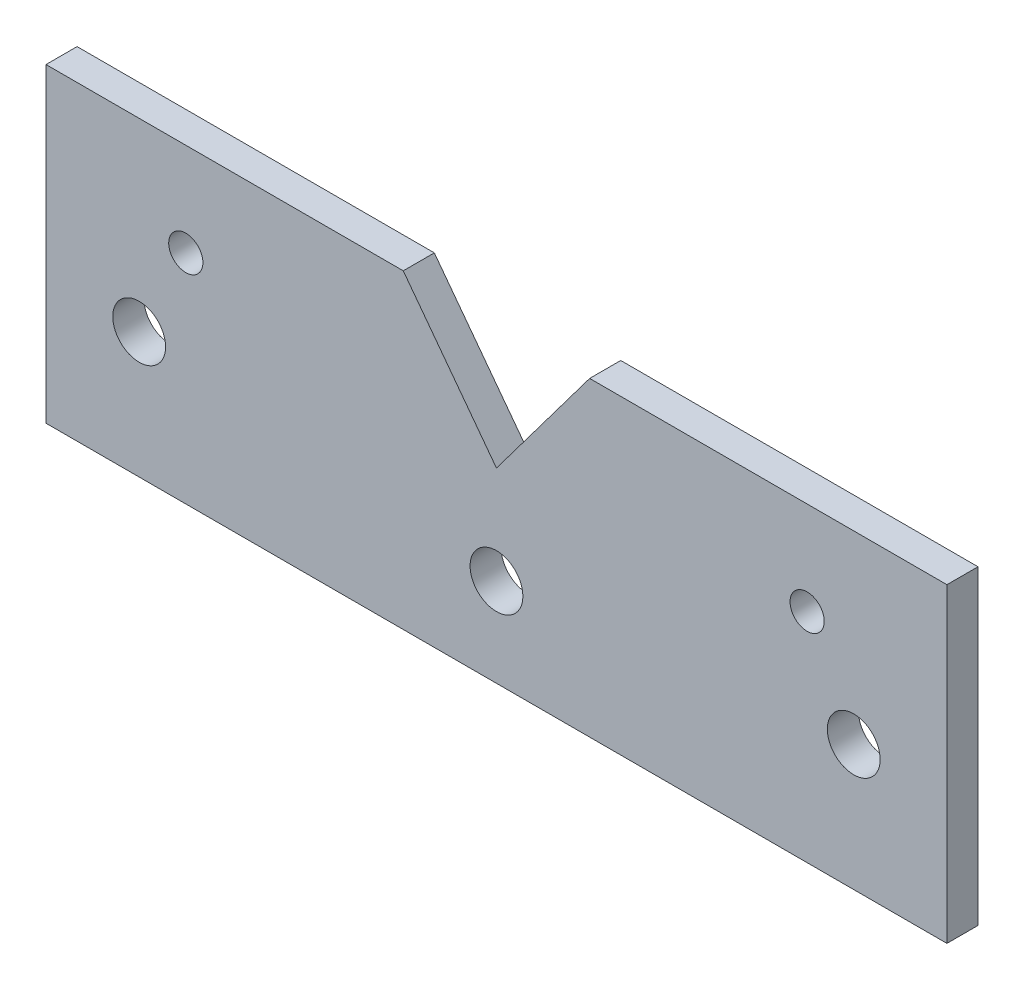
ISO-10303-21;
HEADER;
FILE_DESCRIPTION(('STEP AP214'),'2;1');
FILE_NAME('part.step','',(''),(''),'','','');
FILE_SCHEMA(('AUTOMOTIVE_DESIGN { 1 0 10303 214 1 1 1 1 }'));
ENDSEC;
DATA;
#1=APPLICATION_CONTEXT('core data for automotive mechanical design processes');
#2=APPLICATION_PROTOCOL_DEFINITION('international standard','automotive_design',2000,#1);
#3=PRODUCT_CONTEXT('',#1,'mechanical');
#4=PRODUCT('Part','Part','',(#3));
#5=PRODUCT_RELATED_PRODUCT_CATEGORY('part','',(#4));
#6=PRODUCT_DEFINITION_FORMATION('','',#4);
#7=PRODUCT_DEFINITION_CONTEXT('part definition',#1,'design');
#8=PRODUCT_DEFINITION('design','',#6,#7);
#9=PRODUCT_DEFINITION_SHAPE('','',#8);
#10=(LENGTH_UNIT() NAMED_UNIT(*) SI_UNIT(.MILLI.,.METRE.));
#11=(NAMED_UNIT(*) PLANE_ANGLE_UNIT() SI_UNIT($,.RADIAN.));
#12=(NAMED_UNIT(*) SI_UNIT($,.STERADIAN.) SOLID_ANGLE_UNIT());
#13=UNCERTAINTY_MEASURE_WITH_UNIT(LENGTH_MEASURE(1.E-05),#10,'distance_accuracy_value','');
#14=(GEOMETRIC_REPRESENTATION_CONTEXT(3) GLOBAL_UNCERTAINTY_ASSIGNED_CONTEXT((#13)) GLOBAL_UNIT_ASSIGNED_CONTEXT((#10,
#11,#12)) REPRESENTATION_CONTEXT('',''));
#15=CARTESIAN_POINT('',(0.,0.,0.));
#16=DIRECTION('',(0.,0.,1.));
#17=DIRECTION('',(1.,0.,0.));
#18=AXIS2_PLACEMENT_3D('',#15,#16,#17);
#19=CARTESIAN_POINT('',(0.,0.,5.));
#20=DIRECTION('',(0.,0.,-1.));
#21=DIRECTION('',(-1.,0.,0.));
#22=AXIS2_PLACEMENT_3D('',#19,#20,#21);
#23=PLANE('',#22);
#24=DIRECTION('',(1.,0.,0.));
#25=VECTOR('',#24,1.);
#26=CARTESIAN_POINT('',(145.,0.,5.));
#27=LINE('',#26,#25);
#28=CARTESIAN_POINT('',(0.,0.,5.));
#29=VERTEX_POINT('',#28);
#30=CARTESIAN_POINT('',(145.,0.,5.));
#31=VERTEX_POINT('',#30);
#32=EDGE_CURVE('E136',#29,#31,#27,.T.);
#33=ORIENTED_EDGE('',*,*,#32,.T.);
#34=DIRECTION('',(0.,1.,0.));
#35=VECTOR('',#34,1.);
#36=CARTESIAN_POINT('',(145.,50.,5.));
#37=LINE('',#36,#35);
#38=CARTESIAN_POINT('',(145.,50.,5.));
#39=VERTEX_POINT('',#38);
#40=EDGE_CURVE('E89',#31,#39,#37,.T.);
#41=ORIENTED_EDGE('',*,*,#40,.T.);
#42=DIRECTION('',(-1.,0.,0.));
#43=VECTOR('',#42,1.);
#44=CARTESIAN_POINT('',(87.5,50.,5.));
#45=LINE('',#44,#43);
#46=CARTESIAN_POINT('',(87.5,50.,5.));
#47=VERTEX_POINT('',#46);
#48=EDGE_CURVE('E148',#39,#47,#45,.T.);
#49=ORIENTED_EDGE('',*,*,#48,.T.);
#50=DIRECTION('',(-0.6,-0.8,0.));
#51=VECTOR('',#50,1.);
#52=CARTESIAN_POINT('',(72.5,30.,5.));
#53=LINE('',#52,#51);
#54=CARTESIAN_POINT('',(72.5,30.,5.));
#55=VERTEX_POINT('',#54);
#56=EDGE_CURVE('E105',#47,#55,#53,.T.);
#57=ORIENTED_EDGE('',*,*,#56,.T.);
#58=DIRECTION('',(-0.6,0.8,0.));
#59=VECTOR('',#58,1.);
#60=CARTESIAN_POINT('',(57.5,50.,5.));
#61=LINE('',#60,#59);
#62=CARTESIAN_POINT('',(57.5,50.,5.));
#63=VERTEX_POINT('',#62);
#64=EDGE_CURVE('E99',#55,#63,#61,.T.);
#65=ORIENTED_EDGE('',*,*,#64,.T.);
#66=DIRECTION('',(-1.,0.,0.));
#67=VECTOR('',#66,1.);
#68=CARTESIAN_POINT('',(0.,50.,5.));
#69=LINE('',#68,#67);
#70=CARTESIAN_POINT('',(0.,50.,5.));
#71=VERTEX_POINT('',#70);
#72=EDGE_CURVE('E103',#63,#71,#69,.T.);
#73=ORIENTED_EDGE('',*,*,#72,.T.);
#74=DIRECTION('',(0.,-1.,0.));
#75=VECTOR('',#74,1.);
#76=CARTESIAN_POINT('',(0.,0.,5.));
#77=LINE('',#76,#75);
#78=EDGE_CURVE('E49',#71,#29,#77,.T.);
#79=ORIENTED_EDGE('',*,*,#78,.T.);
#80=EDGE_LOOP('',(#33,#41,#49,#57,#65,#73,#79));
#81=FACE_BOUND('',#80,.T.);
#82=CARTESIAN_POINT('',(22.5,35.,5.));
#83=DIRECTION('',(0.,0.,1.));
#84=DIRECTION('',(1.,0.,0.));
#85=AXIS2_PLACEMENT_3D('',#82,#83,#84);
#86=CIRCLE('',#85,2.75);
#87=CARTESIAN_POINT('',(25.25,35.,5.));
#88=VERTEX_POINT('',#87);
#89=EDGE_CURVE('E127',#88,#88,#86,.T.);
#90=ORIENTED_EDGE('',*,*,#89,.F.);
#91=EDGE_LOOP('',(#90));
#92=FACE_BOUND('',#91,.T.);
#93=CARTESIAN_POINT('',(122.5,35.,5.));
#94=DIRECTION('',(0.,0.,1.));
#95=DIRECTION('',(1.,0.,0.));
#96=AXIS2_PLACEMENT_3D('',#93,#94,#95);
#97=CIRCLE('',#96,2.74999999999999);
#98=CARTESIAN_POINT('',(125.25,35.,5.));
#99=VERTEX_POINT('',#98);
#100=EDGE_CURVE('E163',#99,#99,#97,.T.);
#101=ORIENTED_EDGE('',*,*,#100,.F.);
#102=EDGE_LOOP('',(#101));
#103=FACE_BOUND('',#102,.T.);
#104=CARTESIAN_POINT('',(15.,20.25,5.));
#105=DIRECTION('',(0.,0.,1.));
#106=DIRECTION('',(1.,0.,0.));
#107=AXIS2_PLACEMENT_3D('',#104,#105,#106);
#108=CIRCLE('',#107,4.25);
#109=CARTESIAN_POINT('',(19.25,20.25,5.));
#110=VERTEX_POINT('',#109);
#111=EDGE_CURVE('E169',#110,#110,#108,.T.);
#112=ORIENTED_EDGE('',*,*,#111,.F.);
#113=EDGE_LOOP('',(#112));
#114=FACE_BOUND('',#113,.T.);
#115=CARTESIAN_POINT('',(130.,20.25,5.));
#116=DIRECTION('',(0.,0.,1.));
#117=DIRECTION('',(1.,0.,0.));
#118=AXIS2_PLACEMENT_3D('',#115,#116,#117);
#119=CIRCLE('',#118,4.25);
#120=CARTESIAN_POINT('',(134.25,20.25,5.));
#121=VERTEX_POINT('',#120);
#122=EDGE_CURVE('E175',#121,#121,#119,.T.);
#123=ORIENTED_EDGE('',*,*,#122,.F.);
#124=EDGE_LOOP('',(#123));
#125=FACE_BOUND('',#124,.T.);
#126=CARTESIAN_POINT('',(72.5,14.25,5.));
#127=DIRECTION('',(0.,0.,1.));
#128=DIRECTION('',(1.,0.,0.));
#129=AXIS2_PLACEMENT_3D('',#126,#127,#128);
#130=CIRCLE('',#129,4.25000000000001);
#131=CARTESIAN_POINT('',(76.75,14.25,5.));
#132=VERTEX_POINT('',#131);
#133=EDGE_CURVE('E181',#132,#132,#130,.T.);
#134=ORIENTED_EDGE('',*,*,#133,.F.);
#135=EDGE_LOOP('',(#134));
#136=FACE_BOUND('',#135,.T.);
#137=ADVANCED_FACE('F32',(#81,#92,#103,#114,#125,#136),#23,.F.);
#138=CARTESIAN_POINT('',(0.,0.,0.));
#139=DIRECTION('',(0.,0.,-1.));
#140=DIRECTION('',(-1.,0.,0.));
#141=AXIS2_PLACEMENT_3D('',#138,#139,#140);
#142=PLANE('',#141);
#143=CARTESIAN_POINT('',(130.,20.25,0.));
#144=DIRECTION('',(0.,0.,1.));
#145=DIRECTION('',(1.,0.,0.));
#146=AXIS2_PLACEMENT_3D('',#143,#144,#145);
#147=CIRCLE('',#146,4.25);
#148=CARTESIAN_POINT('',(134.25,20.25,0.));
#149=VERTEX_POINT('',#148);
#150=EDGE_CURVE('E178',#149,#149,#147,.T.);
#151=ORIENTED_EDGE('',*,*,#150,.T.);
#152=EDGE_LOOP('',(#151));
#153=FACE_BOUND('',#152,.T.);
#154=CARTESIAN_POINT('',(122.5,35.,0.));
#155=DIRECTION('',(0.,0.,1.));
#156=DIRECTION('',(1.,0.,0.));
#157=AXIS2_PLACEMENT_3D('',#154,#155,#156);
#158=CIRCLE('',#157,2.74999999999999);
#159=CARTESIAN_POINT('',(125.25,35.,0.));
#160=VERTEX_POINT('',#159);
#161=EDGE_CURVE('E166',#160,#160,#158,.T.);
#162=ORIENTED_EDGE('',*,*,#161,.T.);
#163=EDGE_LOOP('',(#162));
#164=FACE_BOUND('',#163,.T.);
#165=DIRECTION('',(1.,0.,0.));
#166=VECTOR('',#165,1.);
#167=CARTESIAN_POINT('',(145.,0.,0.));
#168=LINE('',#167,#166);
#169=CARTESIAN_POINT('',(0.,0.,0.));
#170=VERTEX_POINT('',#169);
#171=CARTESIAN_POINT('',(145.,0.,0.));
#172=VERTEX_POINT('',#171);
#173=EDGE_CURVE('E123',#170,#172,#168,.T.);
#174=ORIENTED_EDGE('',*,*,#173,.F.);
#175=DIRECTION('',(0.,-1.,0.));
#176=VECTOR('',#175,1.);
#177=CARTESIAN_POINT('',(0.,0.,0.));
#178=LINE('',#177,#176);
#179=CARTESIAN_POINT('',(0.,50.,0.));
#180=VERTEX_POINT('',#179);
#181=EDGE_CURVE('E81',#180,#170,#178,.T.);
#182=ORIENTED_EDGE('',*,*,#181,.F.);
#183=DIRECTION('',(-1.,0.,0.));
#184=VECTOR('',#183,1.);
#185=CARTESIAN_POINT('',(0.,50.,0.));
#186=LINE('',#185,#184);
#187=CARTESIAN_POINT('',(57.5,50.,0.));
#188=VERTEX_POINT('',#187);
#189=EDGE_CURVE('E75',#188,#180,#186,.T.);
#190=ORIENTED_EDGE('',*,*,#189,.F.);
#191=DIRECTION('',(-0.6,0.8,0.));
#192=VECTOR('',#191,1.);
#193=CARTESIAN_POINT('',(57.5,50.,0.));
#194=LINE('',#193,#192);
#195=CARTESIAN_POINT('',(72.5,30.,0.));
#196=VERTEX_POINT('',#195);
#197=EDGE_CURVE('E113',#196,#188,#194,.T.);
#198=ORIENTED_EDGE('',*,*,#197,.F.);
#199=DIRECTION('',(-0.6,-0.8,0.));
#200=VECTOR('',#199,1.);
#201=CARTESIAN_POINT('',(72.5,30.,0.));
#202=LINE('',#201,#200);
#203=CARTESIAN_POINT('',(87.5,50.,0.));
#204=VERTEX_POINT('',#203);
#205=EDGE_CURVE('E131',#204,#196,#202,.T.);
#206=ORIENTED_EDGE('',*,*,#205,.F.);
#207=DIRECTION('',(-1.,0.,0.));
#208=VECTOR('',#207,1.);
#209=CARTESIAN_POINT('',(87.5,50.,0.));
#210=LINE('',#209,#208);
#211=CARTESIAN_POINT('',(145.,50.,0.));
#212=VERTEX_POINT('',#211);
#213=EDGE_CURVE('E129',#212,#204,#210,.T.);
#214=ORIENTED_EDGE('',*,*,#213,.F.);
#215=DIRECTION('',(0.,1.,0.));
#216=VECTOR('',#215,1.);
#217=CARTESIAN_POINT('',(145.,50.,0.));
#218=LINE('',#217,#216);
#219=EDGE_CURVE('E126',#172,#212,#218,.T.);
#220=ORIENTED_EDGE('',*,*,#219,.F.);
#221=EDGE_LOOP('',(#174,#182,#190,#198,#206,#214,#220));
#222=FACE_BOUND('',#221,.T.);
#223=CARTESIAN_POINT('',(22.5,35.,0.));
#224=DIRECTION('',(0.,0.,1.));
#225=DIRECTION('',(1.,0.,0.));
#226=AXIS2_PLACEMENT_3D('',#223,#224,#225);
#227=CIRCLE('',#226,2.75);
#228=CARTESIAN_POINT('',(25.25,35.,0.));
#229=VERTEX_POINT('',#228);
#230=EDGE_CURVE('E160',#229,#229,#227,.T.);
#231=ORIENTED_EDGE('',*,*,#230,.T.);
#232=EDGE_LOOP('',(#231));
#233=FACE_BOUND('',#232,.T.);
#234=CARTESIAN_POINT('',(15.,20.25,0.));
#235=DIRECTION('',(0.,0.,1.));
#236=DIRECTION('',(1.,0.,0.));
#237=AXIS2_PLACEMENT_3D('',#234,#235,#236);
#238=CIRCLE('',#237,4.25);
#239=CARTESIAN_POINT('',(19.25,20.25,0.));
#240=VERTEX_POINT('',#239);
#241=EDGE_CURVE('E172',#240,#240,#238,.T.);
#242=ORIENTED_EDGE('',*,*,#241,.T.);
#243=EDGE_LOOP('',(#242));
#244=FACE_BOUND('',#243,.T.);
#245=CARTESIAN_POINT('',(72.5,14.25,0.));
#246=DIRECTION('',(0.,0.,1.));
#247=DIRECTION('',(1.,0.,0.));
#248=AXIS2_PLACEMENT_3D('',#245,#246,#247);
#249=CIRCLE('',#248,4.25000000000001);
#250=CARTESIAN_POINT('',(76.75,14.25,0.));
#251=VERTEX_POINT('',#250);
#252=EDGE_CURVE('E184',#251,#251,#249,.T.);
#253=ORIENTED_EDGE('',*,*,#252,.T.);
#254=EDGE_LOOP('',(#253));
#255=FACE_BOUND('',#254,.T.);
#256=ADVANCED_FACE('F152',(#153,#164,#222,#233,#244,#255),#142,.T.);
#257=CARTESIAN_POINT('',(145.,0.,5.));
#258=DIRECTION('',(0.,1.,0.));
#259=DIRECTION('',(0.,0.,1.));
#260=AXIS2_PLACEMENT_3D('',#257,#258,#259);
#261=PLANE('',#260);
#262=ORIENTED_EDGE('',*,*,#173,.T.);
#263=DIRECTION('',(0.,0.,-1.));
#264=VECTOR('',#263,1.);
#265=CARTESIAN_POINT('',(145.,0.,5.));
#266=LINE('',#265,#264);
#267=EDGE_CURVE('E11',#31,#172,#266,.T.);
#268=ORIENTED_EDGE('',*,*,#267,.F.);
#269=ORIENTED_EDGE('',*,*,#32,.F.);
#270=DIRECTION('',(0.,0.,-1.));
#271=VECTOR('',#270,1.);
#272=CARTESIAN_POINT('',(0.,0.,5.));
#273=LINE('',#272,#271);
#274=EDGE_CURVE('E119',#29,#170,#273,.T.);
#275=ORIENTED_EDGE('',*,*,#274,.T.);
#276=EDGE_LOOP('',(#262,#268,#269,#275));
#277=FACE_BOUND('',#276,.T.);
#278=ADVANCED_FACE('F34',(#277),#261,.F.);
#279=CARTESIAN_POINT('',(145.,50.,5.));
#280=DIRECTION('',(-1.,0.,0.));
#281=DIRECTION('',(0.,-1.,0.));
#282=AXIS2_PLACEMENT_3D('',#279,#280,#281);
#283=PLANE('',#282);
#284=ORIENTED_EDGE('',*,*,#219,.T.);
#285=DIRECTION('',(0.,0.,-1.));
#286=VECTOR('',#285,1.);
#287=CARTESIAN_POINT('',(145.,50.,5.));
#288=LINE('',#287,#286);
#289=EDGE_CURVE('E41',#39,#212,#288,.T.);
#290=ORIENTED_EDGE('',*,*,#289,.F.);
#291=ORIENTED_EDGE('',*,*,#40,.F.);
#292=ORIENTED_EDGE('',*,*,#267,.T.);
#293=EDGE_LOOP('',(#284,#290,#291,#292));
#294=FACE_BOUND('',#293,.T.);
#295=ADVANCED_FACE('F214',(#294),#283,.F.);
#296=CARTESIAN_POINT('',(87.5,50.,5.));
#297=DIRECTION('',(0.,-1.,0.));
#298=DIRECTION('',(0.,0.,-1.));
#299=AXIS2_PLACEMENT_3D('',#296,#297,#298);
#300=PLANE('',#299);
#301=ORIENTED_EDGE('',*,*,#213,.T.);
#302=DIRECTION('',(0.,0.,-1.));
#303=VECTOR('',#302,1.);
#304=CARTESIAN_POINT('',(87.5,50.,5.));
#305=LINE('',#304,#303);
#306=EDGE_CURVE('E140',#47,#204,#305,.T.);
#307=ORIENTED_EDGE('',*,*,#306,.F.);
#308=ORIENTED_EDGE('',*,*,#48,.F.);
#309=ORIENTED_EDGE('',*,*,#289,.T.);
#310=EDGE_LOOP('',(#301,#307,#308,#309));
#311=FACE_BOUND('',#310,.T.);
#312=ADVANCED_FACE('F146',(#311),#300,.F.);
#313=CARTESIAN_POINT('',(72.5,30.,5.));
#314=DIRECTION('',(0.8,-0.6,0.));
#315=DIRECTION('',(0.6,0.8,0.));
#316=AXIS2_PLACEMENT_3D('',#313,#314,#315);
#317=PLANE('',#316);
#318=ORIENTED_EDGE('',*,*,#205,.T.);
#319=DIRECTION('',(0.,0.,-1.));
#320=VECTOR('',#319,1.);
#321=CARTESIAN_POINT('',(72.5,30.,5.));
#322=LINE('',#321,#320);
#323=EDGE_CURVE('E114',#55,#196,#322,.T.);
#324=ORIENTED_EDGE('',*,*,#323,.F.);
#325=ORIENTED_EDGE('',*,*,#56,.F.);
#326=ORIENTED_EDGE('',*,*,#306,.T.);
#327=EDGE_LOOP('',(#318,#324,#325,#326));
#328=FACE_BOUND('',#327,.T.);
#329=ADVANCED_FACE('F155',(#328),#317,.F.);
#330=CARTESIAN_POINT('',(57.5,50.,5.));
#331=DIRECTION('',(-0.8,-0.6,0.));
#332=DIRECTION('',(0.6,-0.8,0.));
#333=AXIS2_PLACEMENT_3D('',#330,#331,#332);
#334=PLANE('',#333);
#335=ORIENTED_EDGE('',*,*,#197,.T.);
#336=DIRECTION('',(0.,0.,-1.));
#337=VECTOR('',#336,1.);
#338=CARTESIAN_POINT('',(57.5,50.,5.));
#339=LINE('',#338,#337);
#340=EDGE_CURVE('E110',#63,#188,#339,.T.);
#341=ORIENTED_EDGE('',*,*,#340,.F.);
#342=ORIENTED_EDGE('',*,*,#64,.F.);
#343=ORIENTED_EDGE('',*,*,#323,.T.);
#344=EDGE_LOOP('',(#335,#341,#342,#343));
#345=FACE_BOUND('',#344,.T.);
#346=ADVANCED_FACE('F111',(#345),#334,.F.);
#347=CARTESIAN_POINT('',(0.,50.,5.));
#348=DIRECTION('',(0.,-1.,0.));
#349=DIRECTION('',(0.,0.,-1.));
#350=AXIS2_PLACEMENT_3D('',#347,#348,#349);
#351=PLANE('',#350);
#352=ORIENTED_EDGE('',*,*,#189,.T.);
#353=DIRECTION('',(0.,0.,-1.));
#354=VECTOR('',#353,1.);
#355=CARTESIAN_POINT('',(0.,50.,5.));
#356=LINE('',#355,#354);
#357=EDGE_CURVE('E115',#71,#180,#356,.T.);
#358=ORIENTED_EDGE('',*,*,#357,.F.);
#359=ORIENTED_EDGE('',*,*,#72,.F.);
#360=ORIENTED_EDGE('',*,*,#340,.T.);
#361=EDGE_LOOP('',(#352,#358,#359,#360));
#362=FACE_BOUND('',#361,.T.);
#363=ADVANCED_FACE('F117',(#362),#351,.F.);
#364=CARTESIAN_POINT('',(0.,0.,5.));
#365=DIRECTION('',(1.,0.,0.));
#366=DIRECTION('',(0.,0.,-1.));
#367=AXIS2_PLACEMENT_3D('',#364,#365,#366);
#368=PLANE('',#367);
#369=ORIENTED_EDGE('',*,*,#181,.T.);
#370=ORIENTED_EDGE('',*,*,#274,.F.);
#371=ORIENTED_EDGE('',*,*,#78,.F.);
#372=ORIENTED_EDGE('',*,*,#357,.T.);
#373=EDGE_LOOP('',(#369,#370,#371,#372));
#374=FACE_BOUND('',#373,.T.);
#375=ADVANCED_FACE('F204',(#374),#368,.F.);
#376=CARTESIAN_POINT('',(22.5,35.,5.));
#377=DIRECTION('',(0.,0.,-1.));
#378=DIRECTION('',(-1.,0.,0.));
#379=AXIS2_PLACEMENT_3D('',#376,#377,#378);
#380=CYLINDRICAL_SURFACE('',#379,2.75);
#381=ORIENTED_EDGE('',*,*,#89,.T.);
#382=EDGE_LOOP('',(#381));
#383=FACE_BOUND('',#382,.T.);
#384=ORIENTED_EDGE('',*,*,#230,.F.);
#385=EDGE_LOOP('',(#384));
#386=FACE_BOUND('',#385,.T.);
#387=ADVANCED_FACE('F201',(#383,#386),#380,.F.);
#388=CARTESIAN_POINT('',(122.5,35.,5.));
#389=DIRECTION('',(0.,0.,-1.));
#390=DIRECTION('',(-1.,0.,0.));
#391=AXIS2_PLACEMENT_3D('',#388,#389,#390);
#392=CYLINDRICAL_SURFACE('',#391,2.74999999999999);
#393=ORIENTED_EDGE('',*,*,#100,.T.);
#394=EDGE_LOOP('',(#393));
#395=FACE_BOUND('',#394,.T.);
#396=ORIENTED_EDGE('',*,*,#161,.F.);
#397=EDGE_LOOP('',(#396));
#398=FACE_BOUND('',#397,.T.);
#399=ADVANCED_FACE('F273',(#395,#398),#392,.F.);
#400=CARTESIAN_POINT('',(15.,20.25,5.));
#401=DIRECTION('',(0.,0.,-1.));
#402=DIRECTION('',(-1.,0.,0.));
#403=AXIS2_PLACEMENT_3D('',#400,#401,#402);
#404=CYLINDRICAL_SURFACE('',#403,4.25);
#405=ORIENTED_EDGE('',*,*,#111,.T.);
#406=EDGE_LOOP('',(#405));
#407=FACE_BOUND('',#406,.T.);
#408=ORIENTED_EDGE('',*,*,#241,.F.);
#409=EDGE_LOOP('',(#408));
#410=FACE_BOUND('',#409,.T.);
#411=ADVANCED_FACE('F281',(#407,#410),#404,.F.);
#412=CARTESIAN_POINT('',(130.,20.25,5.));
#413=DIRECTION('',(0.,0.,-1.));
#414=DIRECTION('',(-1.,0.,0.));
#415=AXIS2_PLACEMENT_3D('',#412,#413,#414);
#416=CYLINDRICAL_SURFACE('',#415,4.25);
#417=ORIENTED_EDGE('',*,*,#122,.T.);
#418=EDGE_LOOP('',(#417));
#419=FACE_BOUND('',#418,.T.);
#420=ORIENTED_EDGE('',*,*,#150,.F.);
#421=EDGE_LOOP('',(#420));
#422=FACE_BOUND('',#421,.T.);
#423=ADVANCED_FACE('F289',(#419,#422),#416,.F.);
#424=CARTESIAN_POINT('',(72.5,14.25,5.));
#425=DIRECTION('',(0.,0.,-1.));
#426=DIRECTION('',(-1.,0.,0.));
#427=AXIS2_PLACEMENT_3D('',#424,#425,#426);
#428=CYLINDRICAL_SURFACE('',#427,4.25000000000001);
#429=ORIENTED_EDGE('',*,*,#133,.T.);
#430=EDGE_LOOP('',(#429));
#431=FACE_BOUND('',#430,.T.);
#432=ORIENTED_EDGE('',*,*,#252,.F.);
#433=EDGE_LOOP('',(#432));
#434=FACE_BOUND('',#433,.T.);
#435=ADVANCED_FACE('F190',(#431,#434),#428,.F.);
#436=CLOSED_SHELL('',(#137,#256,#278,#295,#312,#329,#346,#363,#375,#387,#399,#411,#423,#435));
#437=MANIFOLD_SOLID_BREP('B2',#436);
#438=ADVANCED_BREP_SHAPE_REPRESENTATION('',(#18,#437),#14);
#439=SHAPE_DEFINITION_REPRESENTATION(#9,#438);
ENDSEC;
END-ISO-10303-21;
